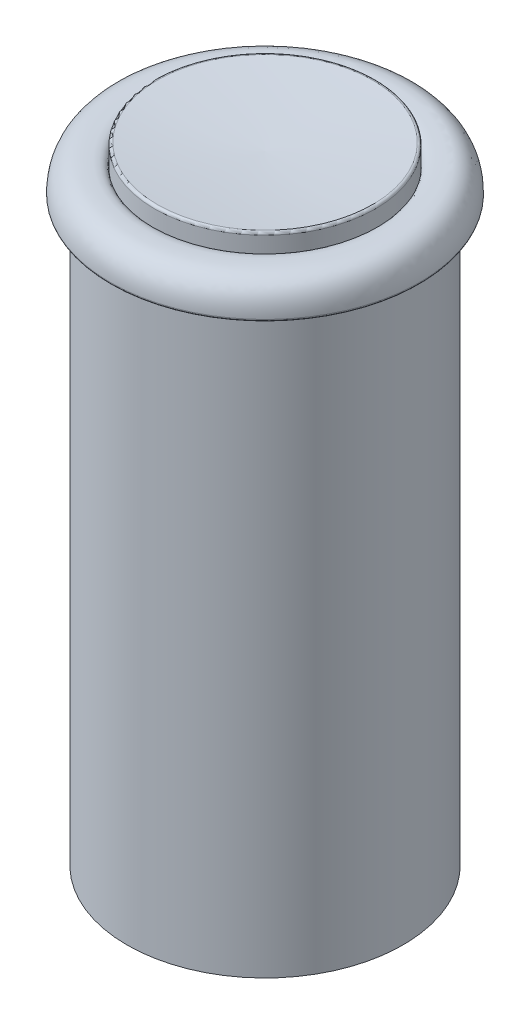
ISO-10303-21;
HEADER;
FILE_DESCRIPTION(('STEP AP214'),'2;1');
FILE_NAME('part.step','',(''),(''),'','','');
FILE_SCHEMA(('AUTOMOTIVE_DESIGN { 1 0 10303 214 1 1 1 1 }'));
ENDSEC;
DATA;
#1=APPLICATION_CONTEXT('core data for automotive mechanical design processes');
#2=APPLICATION_PROTOCOL_DEFINITION('international standard','automotive_design',2000,#1);
#3=PRODUCT_CONTEXT('',#1,'mechanical');
#4=PRODUCT('Part','Part','',(#3));
#5=PRODUCT_RELATED_PRODUCT_CATEGORY('part','',(#4));
#6=PRODUCT_DEFINITION_FORMATION('','',#4);
#7=PRODUCT_DEFINITION_CONTEXT('part definition',#1,'design');
#8=PRODUCT_DEFINITION('design','',#6,#7);
#9=PRODUCT_DEFINITION_SHAPE('','',#8);
#10=(LENGTH_UNIT() NAMED_UNIT(*) SI_UNIT(.MILLI.,.METRE.));
#11=(NAMED_UNIT(*) PLANE_ANGLE_UNIT() SI_UNIT($,.RADIAN.));
#12=(NAMED_UNIT(*) SI_UNIT($,.STERADIAN.) SOLID_ANGLE_UNIT());
#13=UNCERTAINTY_MEASURE_WITH_UNIT(LENGTH_MEASURE(1.E-05),#10,'distance_accuracy_value','');
#14=(GEOMETRIC_REPRESENTATION_CONTEXT(3) GLOBAL_UNCERTAINTY_ASSIGNED_CONTEXT((#13)) GLOBAL_UNIT_ASSIGNED_CONTEXT((#10,
#11,#12)) REPRESENTATION_CONTEXT('',''));
#15=CARTESIAN_POINT('',(0.,0.,0.));
#16=DIRECTION('',(0.,0.,1.));
#17=DIRECTION('',(1.,0.,0.));
#18=AXIS2_PLACEMENT_3D('',#15,#16,#17);
#19=CARTESIAN_POINT('',(0.,206.487561997508,-4.61913148723235));
#20=DIRECTION('',(-1.,0.,0.));
#21=DIRECTION('',(0.,0.,1.));
#22=AXIS2_PLACEMENT_3D('',#19,#20,#21);
#23=CIRCLE('',#22,142.539673412336);
#24=TRIMMED_CURVE('',#23,(PARAMETER_VALUE(-1.53838471662136)),
(PARAMETER_VALUE(1.53838471662136)),.T.,.PARAMETER.);
#25=CARTESIAN_POINT('',(0.,206.487561997508,0.));
#26=DIRECTION('',(0.,1.,0.));
#27=AXIS1_PLACEMENT('',#25,#26);
#28=SURFACE_OF_REVOLUTION('',#24,#27);
#29=CARTESIAN_POINT('',(0.,64.8226083371772,0.));
#30=DIRECTION('',(0.,1.,0.));
#31=DIRECTION('',(0.,0.,1.));
#32=AXIS2_PLACEMENT_3D('',#29,#30,#31);
#33=CIRCLE('',#32,11.1479037734524);
#34=CARTESIAN_POINT('',(0.,64.8226083371772,11.1479037734524));
#35=VERTEX_POINT('',#34);
#36=EDGE_CURVE('E40',#35,#35,#33,.T.);
#37=ORIENTED_EDGE('',*,*,#36,.T.);
#38=EDGE_LOOP('',(#37));
#39=FACE_BOUND('',#38,.T.);
#40=CARTESIAN_POINT('',(0.,64.0227518835749,0.));
#41=VERTEX_POINT('',#40);
#42=VERTEX_LOOP('',#41);
#43=FACE_BOUND('',#42,.T.);
#44=ADVANCED_FACE('F33',(#39,#43),#28,.F.);
#45=CARTESIAN_POINT('',(0.,65.,0.));
#46=DIRECTION('',(0.,1.,0.));
#47=DIRECTION('',(0.,0.,1.));
#48=AXIS2_PLACEMENT_3D('',#45,#46,#47);
#49=CYLINDRICAL_SURFACE('',#48,11.43);
#50=CARTESIAN_POINT('',(0.,64.5701670528083,0.));
#51=DIRECTION('',(0.,-1.,0.));
#52=DIRECTION('',(0.,0.,-1.));
#53=AXIS2_PLACEMENT_3D('',#50,#51,#52);
#54=CIRCLE('',#53,11.43);
#55=CARTESIAN_POINT('',(0.,64.5701670528083,-11.43));
#56=VERTEX_POINT('',#55);
#57=EDGE_CURVE('E11',#56,#56,#54,.T.);
#58=ORIENTED_EDGE('',*,*,#57,.T.);
#59=EDGE_LOOP('',(#58));
#60=FACE_BOUND('',#59,.T.);
#61=CARTESIAN_POINT('',(0.,62.5,0.));
#62=DIRECTION('',(0.,1.,0.));
#63=DIRECTION('',(0.,0.,1.));
#64=AXIS2_PLACEMENT_3D('',#61,#62,#63);
#65=CIRCLE('',#64,11.43);
#66=CARTESIAN_POINT('',(0.,62.5,11.43));
#67=VERTEX_POINT('',#66);
#68=EDGE_CURVE('E85',#67,#67,#65,.T.);
#69=ORIENTED_EDGE('',*,*,#68,.T.);
#70=EDGE_LOOP('',(#69));
#71=FACE_BOUND('',#70,.T.);
#72=ADVANCED_FACE('F44',(#60,#71),#49,.T.);
#73=CARTESIAN_POINT('',(11.43,62.5,0.));
#74=CARTESIAN_POINT('',(11.43,63.3801288950766,0.));
#75=CARTESIAN_POINT('',(12.666114980423,63.3048886275422,0.));
#76=CARTESIAN_POINT('',(14.3723938123902,63.3953895650605,0.));
#77=CARTESIAN_POINT('',(16.,62.598928516358,0.));
#78=CARTESIAN_POINT('',(16.,60.1699000869399,0.));
#79=B_SPLINE_CURVE_WITH_KNOTS('',3,(#73,#74,#75,#76,#77,#78),.UNSPECIFIED.,.F.,.F.,(4,1,1,4),
(0.,0.469325328732429,0.569325328732429,1.),.UNSPECIFIED.);
#80=CARTESIAN_POINT('',(0.,65.,0.));
#81=DIRECTION('',(0.,1.,0.));
#82=AXIS1_PLACEMENT('',#80,#81);
#83=SURFACE_OF_REVOLUTION('',#79,#82);
#84=CARTESIAN_POINT('',(0.,60.2573778407152,0.));
#85=DIRECTION('',(0.,1.,0.));
#86=DIRECTION('',(0.,0.,1.));
#87=AXIS2_PLACEMENT_3D('',#84,#85,#86);
#88=CIRCLE('',#87,15.9994218754074);
#89=CARTESIAN_POINT('',(0.,60.2573778407152,15.9994218754074));
#90=VERTEX_POINT('',#89);
#91=EDGE_CURVE('E80',#90,#90,#88,.T.);
#92=ORIENTED_EDGE('',*,*,#91,.T.);
#93=EDGE_LOOP('',(#92));
#94=FACE_BOUND('',#93,.T.);
#95=ORIENTED_EDGE('',*,*,#68,.F.);
#96=EDGE_LOOP('',(#95));
#97=FACE_BOUND('',#96,.T.);
#98=ADVANCED_FACE('F50',(#94,#97),#83,.F.);
#99=CARTESIAN_POINT('',(0.,65.,0.));
#100=DIRECTION('',(0.,1.,0.));
#101=DIRECTION('',(0.,0.,1.));
#102=AXIS2_PLACEMENT_3D('',#99,#100,#101);
#103=CYLINDRICAL_SURFACE('',#102,14.2875);
#104=CARTESIAN_POINT('',(0.,59.746,0.));
#105=DIRECTION('',(0.,-1.,0.));
#106=DIRECTION('',(0.,0.,-1.));
#107=AXIS2_PLACEMENT_3D('',#104,#105,#106);
#108=CIRCLE('',#107,14.2875);
#109=CARTESIAN_POINT('',(0.,59.746,-14.2875));
#110=VERTEX_POINT('',#109);
#111=EDGE_CURVE('E74',#110,#110,#108,.T.);
#112=ORIENTED_EDGE('',*,*,#111,.T.);
#113=EDGE_LOOP('',(#112));
#114=FACE_BOUND('',#113,.T.);
#115=CARTESIAN_POINT('',(0.,0.,0.));
#116=DIRECTION('',(0.,1.,0.));
#117=DIRECTION('',(0.,0.,1.));
#118=AXIS2_PLACEMENT_3D('',#115,#116,#117);
#119=CIRCLE('',#118,14.2875);
#120=CARTESIAN_POINT('',(0.,0.,14.2875));
#121=VERTEX_POINT('',#120);
#122=EDGE_CURVE('E98',#121,#121,#119,.T.);
#123=ORIENTED_EDGE('',*,*,#122,.T.);
#124=EDGE_LOOP('',(#123));
#125=FACE_BOUND('',#124,.T.);
#126=ADVANCED_FACE('F92',(#114,#125),#103,.T.);
#127=CARTESIAN_POINT('',(16.,60.,0.));
#128=DIRECTION('',(0.,-1.,0.));
#129=DIRECTION('',(0.,0.,-1.));
#130=AXIS2_PLACEMENT_3D('',#127,#128,#129);
#131=PLANE('',#130);
#132=CARTESIAN_POINT('',(0.,60.,0.));
#133=DIRECTION('',(0.,-1.,0.));
#134=DIRECTION('',(0.,0.,-1.));
#135=AXIS2_PLACEMENT_3D('',#132,#133,#134);
#136=CIRCLE('',#135,15.7454443366523);
#137=CARTESIAN_POINT('',(0.,60.,-15.7454443366523));
#138=VERTEX_POINT('',#137);
#139=EDGE_CURVE('E79',#138,#138,#136,.T.);
#140=ORIENTED_EDGE('',*,*,#139,.T.);
#141=EDGE_LOOP('',(#140));
#142=FACE_BOUND('',#141,.T.);
#143=CARTESIAN_POINT('',(0.,60.,0.));
#144=DIRECTION('',(0.,-1.,0.));
#145=DIRECTION('',(0.,0.,-1.));
#146=AXIS2_PLACEMENT_3D('',#143,#144,#145);
#147=CIRCLE('',#146,14.5415);
#148=CARTESIAN_POINT('',(0.,60.,-14.5415));
#149=VERTEX_POINT('',#148);
#150=EDGE_CURVE('E77',#149,#149,#147,.F.);
#151=ORIENTED_EDGE('',*,*,#150,.T.);
#152=EDGE_LOOP('',(#151));
#153=FACE_BOUND('',#152,.T.);
#154=ADVANCED_FACE('F60',(#142,#153),#131,.T.);
#155=CARTESIAN_POINT('',(0.,0.,0.));
#156=DIRECTION('',(0.,1.,0.));
#157=DIRECTION('',(0.,0.,1.));
#158=AXIS2_PLACEMENT_3D('',#155,#156,#157);
#159=PLANE('',#158);
#160=ORIENTED_EDGE('',*,*,#122,.F.);
#161=EDGE_LOOP('',(#160));
#162=FACE_BOUND('',#161,.T.);
#163=ADVANCED_FACE('F56',(#162),#159,.F.);
#164=CARTESIAN_POINT('',(0.,60.254,0.));
#165=DIRECTION('',(0.,1.,0.));
#166=DIRECTION('',(0.,0.,1.));
#167=AXIS2_PLACEMENT_3D('',#164,#165,#166);
#168=TOROIDAL_SURFACE('',#167,15.7454443366523,0.254);
#169=ORIENTED_EDGE('',*,*,#139,.F.);
#170=EDGE_LOOP('',(#169));
#171=FACE_BOUND('',#170,.T.);
#172=ORIENTED_EDGE('',*,*,#91,.F.);
#173=EDGE_LOOP('',(#172));
#174=FACE_BOUND('',#173,.T.);
#175=ADVANCED_FACE('F59',(#171,#174),#168,.T.);
#176=CARTESIAN_POINT('',(0.,59.746,0.));
#177=DIRECTION('',(0.,-1.,0.));
#178=DIRECTION('',(0.,0.,-1.));
#179=AXIS2_PLACEMENT_3D('',#176,#177,#178);
#180=TOROIDAL_SURFACE('',#179,14.5415,0.254);
#181=ORIENTED_EDGE('',*,*,#111,.F.);
#182=EDGE_LOOP('',(#181));
#183=FACE_BOUND('',#182,.T.);
#184=ORIENTED_EDGE('',*,*,#150,.F.);
#185=EDGE_LOOP('',(#184));
#186=FACE_BOUND('',#185,.T.);
#187=ADVANCED_FACE('F63',(#183,#186),#180,.F.);
#188=CARTESIAN_POINT('',(0.,64.5701670528083,0.));
#189=DIRECTION('',(0.,-1.,0.));
#190=DIRECTION('',(0.,0.,-1.));
#191=AXIS2_PLACEMENT_3D('',#188,#189,#190);
#192=TOROIDAL_SURFACE('',#191,11.176,0.254);
#193=ORIENTED_EDGE('',*,*,#57,.F.);
#194=EDGE_LOOP('',(#193));
#195=FACE_BOUND('',#194,.T.);
#196=ORIENTED_EDGE('',*,*,#36,.F.);
#197=EDGE_LOOP('',(#196));
#198=FACE_BOUND('',#197,.T.);
#199=ADVANCED_FACE('F35',(#195,#198),#192,.T.);
#200=CLOSED_SHELL('',(#44,#72,#98,#126,#154,#163,#175,#187,#199));
#201=MANIFOLD_SOLID_BREP('B2',#200);
#202=ADVANCED_BREP_SHAPE_REPRESENTATION('',(#18,#201),#14);
#203=SHAPE_DEFINITION_REPRESENTATION(#9,#202);
ENDSEC;
END-ISO-10303-21;
